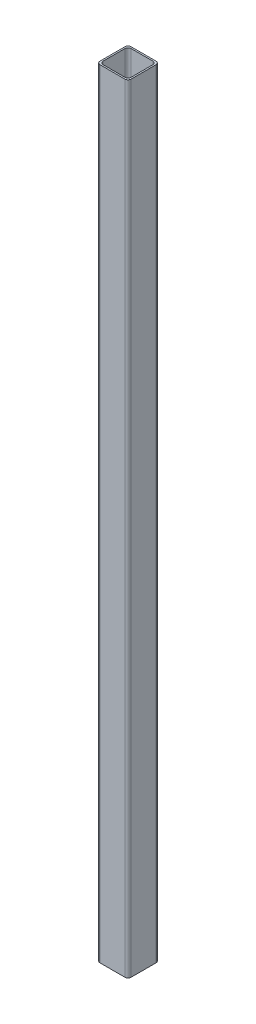
ISO-10303-21;
HEADER;
FILE_DESCRIPTION(('STEP AP214'),'2;1');
FILE_NAME('part.step','',(''),(''),'','','');
FILE_SCHEMA(('AUTOMOTIVE_DESIGN { 1 0 10303 214 1 1 1 1 }'));
ENDSEC;
DATA;
#1=APPLICATION_CONTEXT('core data for automotive mechanical design processes');
#2=APPLICATION_PROTOCOL_DEFINITION('international standard','automotive_design',2000,#1);
#3=PRODUCT_CONTEXT('',#1,'mechanical');
#4=PRODUCT('Part','Part','',(#3));
#5=PRODUCT_RELATED_PRODUCT_CATEGORY('part','',(#4));
#6=PRODUCT_DEFINITION_FORMATION('','',#4);
#7=PRODUCT_DEFINITION_CONTEXT('part definition',#1,'design');
#8=PRODUCT_DEFINITION('design','',#6,#7);
#9=PRODUCT_DEFINITION_SHAPE('','',#8);
#10=(LENGTH_UNIT() NAMED_UNIT(*) SI_UNIT(.MILLI.,.METRE.));
#11=(NAMED_UNIT(*) PLANE_ANGLE_UNIT() SI_UNIT($,.RADIAN.));
#12=(NAMED_UNIT(*) SI_UNIT($,.STERADIAN.) SOLID_ANGLE_UNIT());
#13=UNCERTAINTY_MEASURE_WITH_UNIT(LENGTH_MEASURE(1.E-05),#10,'distance_accuracy_value','');
#14=(GEOMETRIC_REPRESENTATION_CONTEXT(3) GLOBAL_UNCERTAINTY_ASSIGNED_CONTEXT((#13)) GLOBAL_UNIT_ASSIGNED_CONTEXT((#10,
#11,#12)) REPRESENTATION_CONTEXT('',''));
#15=CARTESIAN_POINT('',(0.,0.,0.));
#16=DIRECTION('',(0.,0.,1.));
#17=DIRECTION('',(1.,0.,0.));
#18=AXIS2_PLACEMENT_3D('',#15,#16,#17);
#19=CARTESIAN_POINT('',(16.,500.,16.));
#20=DIRECTION('',(0.,-1.,0.));
#21=DIRECTION('',(0.,0.,-1.));
#22=AXIS2_PLACEMENT_3D('',#19,#20,#21);
#23=PLANE('',#22);
#24=CARTESIAN_POINT('',(16.,500.,16.));
#25=DIRECTION('',(0.,1.,0.));
#26=DIRECTION('',(0.,0.,-1.));
#27=AXIS2_PLACEMENT_3D('',#24,#25,#26);
#28=CIRCLE('',#27,4.);
#29=CARTESIAN_POINT('',(16.,500.,20.));
#30=VERTEX_POINT('',#29);
#31=CARTESIAN_POINT('',(20.,500.,16.));
#32=VERTEX_POINT('',#31);
#33=EDGE_CURVE('E211',#30,#32,#28,.T.);
#34=ORIENTED_EDGE('',*,*,#33,.T.);
#35=DIRECTION('',(0.,0.,-1.));
#36=VECTOR('',#35,1.);
#37=CARTESIAN_POINT('',(20.,500.,16.));
#38=LINE('',#37,#36);
#39=CARTESIAN_POINT('',(20.,500.,-16.));
#40=VERTEX_POINT('',#39);
#41=EDGE_CURVE('E214',#32,#40,#38,.T.);
#42=ORIENTED_EDGE('',*,*,#41,.T.);
#43=CARTESIAN_POINT('',(16.,500.,-16.));
#44=DIRECTION('',(0.,1.,0.));
#45=DIRECTION('',(0.,0.,-1.));
#46=AXIS2_PLACEMENT_3D('',#43,#44,#45);
#47=CIRCLE('',#46,4.);
#48=CARTESIAN_POINT('',(16.,500.,-20.));
#49=VERTEX_POINT('',#48);
#50=EDGE_CURVE('E217',#40,#49,#47,.T.);
#51=ORIENTED_EDGE('',*,*,#50,.T.);
#52=DIRECTION('',(-1.,0.,0.));
#53=VECTOR('',#52,1.);
#54=CARTESIAN_POINT('',(-16.,500.,-20.));
#55=LINE('',#54,#53);
#56=CARTESIAN_POINT('',(-16.,500.,-20.));
#57=VERTEX_POINT('',#56);
#58=EDGE_CURVE('E219',#49,#57,#55,.T.);
#59=ORIENTED_EDGE('',*,*,#58,.T.);
#60=CARTESIAN_POINT('',(-16.,500.,-16.));
#61=DIRECTION('',(0.,1.,0.));
#62=DIRECTION('',(0.,0.,1.));
#63=AXIS2_PLACEMENT_3D('',#60,#61,#62);
#64=CIRCLE('',#63,4.);
#65=CARTESIAN_POINT('',(-20.,500.,-16.));
#66=VERTEX_POINT('',#65);
#67=EDGE_CURVE('E221',#57,#66,#64,.T.);
#68=ORIENTED_EDGE('',*,*,#67,.T.);
#69=DIRECTION('',(0.,0.,1.));
#70=VECTOR('',#69,1.);
#71=CARTESIAN_POINT('',(-20.,500.,16.));
#72=LINE('',#71,#70);
#73=CARTESIAN_POINT('',(-20.,500.,16.));
#74=VERTEX_POINT('',#73);
#75=EDGE_CURVE('E223',#66,#74,#72,.T.);
#76=ORIENTED_EDGE('',*,*,#75,.T.);
#77=CARTESIAN_POINT('',(-16.,500.,16.));
#78=DIRECTION('',(0.,1.,0.));
#79=DIRECTION('',(0.,0.,1.));
#80=AXIS2_PLACEMENT_3D('',#77,#78,#79);
#81=CIRCLE('',#80,4.);
#82=CARTESIAN_POINT('',(-16.,500.,20.));
#83=VERTEX_POINT('',#82);
#84=EDGE_CURVE('E225',#74,#83,#81,.T.);
#85=ORIENTED_EDGE('',*,*,#84,.T.);
#86=DIRECTION('',(1.,0.,0.));
#87=VECTOR('',#86,1.);
#88=CARTESIAN_POINT('',(-16.,500.,20.));
#89=LINE('',#88,#87);
#90=EDGE_CURVE('E227',#83,#30,#89,.T.);
#91=ORIENTED_EDGE('',*,*,#90,.T.);
#92=EDGE_LOOP('',(#34,#42,#51,#59,#68,#76,#85,#91));
#93=FACE_BOUND('',#92,.T.);
#94=CARTESIAN_POINT('',(14.,500.,14.));
#95=DIRECTION('',(0.,1.,0.));
#96=DIRECTION('',(0.,0.,1.));
#97=AXIS2_PLACEMENT_3D('',#94,#95,#96);
#98=CIRCLE('',#97,4.);
#99=CARTESIAN_POINT('',(14.,500.,18.));
#100=VERTEX_POINT('',#99);
#101=CARTESIAN_POINT('',(18.,500.,14.));
#102=VERTEX_POINT('',#101);
#103=EDGE_CURVE('E146',#100,#102,#98,.T.);
#104=ORIENTED_EDGE('',*,*,#103,.F.);
#105=DIRECTION('',(1.,0.,0.));
#106=VECTOR('',#105,1.);
#107=CARTESIAN_POINT('',(-14.,500.,18.));
#108=LINE('',#107,#106);
#109=CARTESIAN_POINT('',(-14.,500.,18.));
#110=VERTEX_POINT('',#109);
#111=EDGE_CURVE('E179',#110,#100,#108,.T.);
#112=ORIENTED_EDGE('',*,*,#111,.F.);
#113=CARTESIAN_POINT('',(-14.,500.,14.));
#114=DIRECTION('',(0.,1.,0.));
#115=DIRECTION('',(0.,0.,-1.));
#116=AXIS2_PLACEMENT_3D('',#113,#114,#115);
#117=CIRCLE('',#116,4.);
#118=CARTESIAN_POINT('',(-18.,500.,14.));
#119=VERTEX_POINT('',#118);
#120=EDGE_CURVE('E177',#119,#110,#117,.T.);
#121=ORIENTED_EDGE('',*,*,#120,.F.);
#122=DIRECTION('',(0.,0.,1.));
#123=VECTOR('',#122,1.);
#124=CARTESIAN_POINT('',(-18.,500.,14.));
#125=LINE('',#124,#123);
#126=CARTESIAN_POINT('',(-18.,500.,-14.));
#127=VERTEX_POINT('',#126);
#128=EDGE_CURVE('E175',#127,#119,#125,.T.);
#129=ORIENTED_EDGE('',*,*,#128,.F.);
#130=CARTESIAN_POINT('',(-14.,500.,-14.));
#131=DIRECTION('',(0.,1.,0.));
#132=DIRECTION('',(0.,0.,-1.));
#133=AXIS2_PLACEMENT_3D('',#130,#131,#132);
#134=CIRCLE('',#133,4.);
#135=CARTESIAN_POINT('',(-14.,500.,-18.));
#136=VERTEX_POINT('',#135);
#137=EDGE_CURVE('E173',#136,#127,#134,.T.);
#138=ORIENTED_EDGE('',*,*,#137,.F.);
#139=DIRECTION('',(-1.,0.,0.));
#140=VECTOR('',#139,1.);
#141=CARTESIAN_POINT('',(-14.,500.,-18.));
#142=LINE('',#141,#140);
#143=CARTESIAN_POINT('',(14.,500.,-18.));
#144=VERTEX_POINT('',#143);
#145=EDGE_CURVE('E169',#144,#136,#142,.T.);
#146=ORIENTED_EDGE('',*,*,#145,.F.);
#147=CARTESIAN_POINT('',(14.,500.,-14.));
#148=DIRECTION('',(0.,1.,0.));
#149=DIRECTION('',(0.,0.,1.));
#150=AXIS2_PLACEMENT_3D('',#147,#148,#149);
#151=CIRCLE('',#150,4.);
#152=CARTESIAN_POINT('',(18.,500.,-14.));
#153=VERTEX_POINT('',#152);
#154=EDGE_CURVE('E167',#153,#144,#151,.T.);
#155=ORIENTED_EDGE('',*,*,#154,.F.);
#156=DIRECTION('',(0.,0.,-1.));
#157=VECTOR('',#156,1.);
#158=CARTESIAN_POINT('',(18.,500.,14.));
#159=LINE('',#158,#157);
#160=EDGE_CURVE('E154',#102,#153,#159,.T.);
#161=ORIENTED_EDGE('',*,*,#160,.F.);
#162=EDGE_LOOP('',(#104,#112,#121,#129,#138,#146,#155,#161));
#163=FACE_BOUND('',#162,.T.);
#164=ADVANCED_FACE('F33',(#93,#163),#23,.F.);
#165=CARTESIAN_POINT('',(16.,-500.,16.));
#166=DIRECTION('',(0.,-1.,0.));
#167=DIRECTION('',(0.,0.,-1.));
#168=AXIS2_PLACEMENT_3D('',#165,#166,#167);
#169=PLANE('',#168);
#170=CARTESIAN_POINT('',(16.,-500.,16.));
#171=DIRECTION('',(0.,1.,0.));
#172=DIRECTION('',(0.,0.,-1.));
#173=AXIS2_PLACEMENT_3D('',#170,#171,#172);
#174=CIRCLE('',#173,4.);
#175=CARTESIAN_POINT('',(16.,-500.,20.));
#176=VERTEX_POINT('',#175);
#177=CARTESIAN_POINT('',(20.,-500.,16.));
#178=VERTEX_POINT('',#177);
#179=EDGE_CURVE('E162',#176,#178,#174,.T.);
#180=ORIENTED_EDGE('',*,*,#179,.F.);
#181=DIRECTION('',(1.,0.,0.));
#182=VECTOR('',#181,1.);
#183=CARTESIAN_POINT('',(-16.,-500.,20.));
#184=LINE('',#183,#182);
#185=CARTESIAN_POINT('',(-16.,-500.,20.));
#186=VERTEX_POINT('',#185);
#187=EDGE_CURVE('E215',#186,#176,#184,.T.);
#188=ORIENTED_EDGE('',*,*,#187,.F.);
#189=CARTESIAN_POINT('',(-16.,-500.,16.));
#190=DIRECTION('',(0.,1.,0.));
#191=DIRECTION('',(0.,0.,1.));
#192=AXIS2_PLACEMENT_3D('',#189,#190,#191);
#193=CIRCLE('',#192,4.);
#194=CARTESIAN_POINT('',(-20.,-500.,16.));
#195=VERTEX_POINT('',#194);
#196=EDGE_CURVE('E242',#195,#186,#193,.T.);
#197=ORIENTED_EDGE('',*,*,#196,.F.);
#198=DIRECTION('',(0.,0.,1.));
#199=VECTOR('',#198,1.);
#200=CARTESIAN_POINT('',(-20.,-500.,16.));
#201=LINE('',#200,#199);
#202=CARTESIAN_POINT('',(-20.,-500.,-16.));
#203=VERTEX_POINT('',#202);
#204=EDGE_CURVE('E240',#203,#195,#201,.T.);
#205=ORIENTED_EDGE('',*,*,#204,.F.);
#206=CARTESIAN_POINT('',(-16.,-500.,-16.));
#207=DIRECTION('',(0.,1.,0.));
#208=DIRECTION('',(0.,0.,1.));
#209=AXIS2_PLACEMENT_3D('',#206,#207,#208);
#210=CIRCLE('',#209,4.);
#211=CARTESIAN_POINT('',(-16.,-500.,-20.));
#212=VERTEX_POINT('',#211);
#213=EDGE_CURVE('E238',#212,#203,#210,.T.);
#214=ORIENTED_EDGE('',*,*,#213,.F.);
#215=DIRECTION('',(-1.,0.,0.));
#216=VECTOR('',#215,1.);
#217=CARTESIAN_POINT('',(-16.,-500.,-20.));
#218=LINE('',#217,#216);
#219=CARTESIAN_POINT('',(16.,-500.,-20.));
#220=VERTEX_POINT('',#219);
#221=EDGE_CURVE('E236',#220,#212,#218,.T.);
#222=ORIENTED_EDGE('',*,*,#221,.F.);
#223=CARTESIAN_POINT('',(16.,-500.,-16.));
#224=DIRECTION('',(0.,1.,0.));
#225=DIRECTION('',(0.,0.,-1.));
#226=AXIS2_PLACEMENT_3D('',#223,#224,#225);
#227=CIRCLE('',#226,4.);
#228=CARTESIAN_POINT('',(20.,-500.,-16.));
#229=VERTEX_POINT('',#228);
#230=EDGE_CURVE('E234',#229,#220,#227,.T.);
#231=ORIENTED_EDGE('',*,*,#230,.F.);
#232=DIRECTION('',(0.,0.,-1.));
#233=VECTOR('',#232,1.);
#234=CARTESIAN_POINT('',(20.,-500.,16.));
#235=LINE('',#234,#233);
#236=EDGE_CURVE('E232',#178,#229,#235,.T.);
#237=ORIENTED_EDGE('',*,*,#236,.F.);
#238=EDGE_LOOP('',(#180,#188,#197,#205,#214,#222,#231,#237));
#239=FACE_BOUND('',#238,.T.);
#240=DIRECTION('',(1.,0.,0.));
#241=VECTOR('',#240,1.);
#242=CARTESIAN_POINT('',(-14.,-500.,18.));
#243=LINE('',#242,#241);
#244=CARTESIAN_POINT('',(-14.,-500.,18.));
#245=VERTEX_POINT('',#244);
#246=CARTESIAN_POINT('',(14.,-500.,18.));
#247=VERTEX_POINT('',#246);
#248=EDGE_CURVE('E155',#245,#247,#243,.T.);
#249=ORIENTED_EDGE('',*,*,#248,.T.);
#250=CARTESIAN_POINT('',(14.,-500.,14.));
#251=DIRECTION('',(0.,1.,0.));
#252=DIRECTION('',(0.,0.,1.));
#253=AXIS2_PLACEMENT_3D('',#250,#251,#252);
#254=CIRCLE('',#253,4.);
#255=CARTESIAN_POINT('',(18.,-500.,14.));
#256=VERTEX_POINT('',#255);
#257=EDGE_CURVE('E56',#247,#256,#254,.T.);
#258=ORIENTED_EDGE('',*,*,#257,.T.);
#259=DIRECTION('',(0.,0.,-1.));
#260=VECTOR('',#259,1.);
#261=CARTESIAN_POINT('',(18.,-500.,14.));
#262=LINE('',#261,#260);
#263=CARTESIAN_POINT('',(18.,-500.,-14.));
#264=VERTEX_POINT('',#263);
#265=EDGE_CURVE('E161',#256,#264,#262,.T.);
#266=ORIENTED_EDGE('',*,*,#265,.T.);
#267=CARTESIAN_POINT('',(14.,-500.,-14.));
#268=DIRECTION('',(0.,1.,0.));
#269=DIRECTION('',(0.,0.,1.));
#270=AXIS2_PLACEMENT_3D('',#267,#268,#269);
#271=CIRCLE('',#270,4.);
#272=CARTESIAN_POINT('',(14.,-500.,-18.));
#273=VERTEX_POINT('',#272);
#274=EDGE_CURVE('E183',#264,#273,#271,.T.);
#275=ORIENTED_EDGE('',*,*,#274,.T.);
#276=DIRECTION('',(-1.,0.,0.));
#277=VECTOR('',#276,1.);
#278=CARTESIAN_POINT('',(-14.,-500.,-18.));
#279=LINE('',#278,#277);
#280=CARTESIAN_POINT('',(-14.,-500.,-18.));
#281=VERTEX_POINT('',#280);
#282=EDGE_CURVE('E186',#273,#281,#279,.T.);
#283=ORIENTED_EDGE('',*,*,#282,.T.);
#284=CARTESIAN_POINT('',(-14.,-500.,-14.));
#285=DIRECTION('',(0.,1.,0.));
#286=DIRECTION('',(0.,0.,-1.));
#287=AXIS2_PLACEMENT_3D('',#284,#285,#286);
#288=CIRCLE('',#287,4.);
#289=CARTESIAN_POINT('',(-18.,-500.,-14.));
#290=VERTEX_POINT('',#289);
#291=EDGE_CURVE('E189',#281,#290,#288,.T.);
#292=ORIENTED_EDGE('',*,*,#291,.T.);
#293=DIRECTION('',(0.,0.,1.));
#294=VECTOR('',#293,1.);
#295=CARTESIAN_POINT('',(-18.,-500.,14.));
#296=LINE('',#295,#294);
#297=CARTESIAN_POINT('',(-18.,-500.,14.));
#298=VERTEX_POINT('',#297);
#299=EDGE_CURVE('E192',#290,#298,#296,.T.);
#300=ORIENTED_EDGE('',*,*,#299,.T.);
#301=CARTESIAN_POINT('',(-14.,-500.,14.));
#302=DIRECTION('',(0.,1.,0.));
#303=DIRECTION('',(0.,0.,-1.));
#304=AXIS2_PLACEMENT_3D('',#301,#302,#303);
#305=CIRCLE('',#304,4.);
#306=EDGE_CURVE('E195',#298,#245,#305,.T.);
#307=ORIENTED_EDGE('',*,*,#306,.T.);
#308=EDGE_LOOP('',(#249,#258,#266,#275,#283,#292,#300,#307));
#309=FACE_BOUND('',#308,.T.);
#310=ADVANCED_FACE('F272',(#239,#309),#169,.T.);
#311=CARTESIAN_POINT('',(16.,500.,16.));
#312=DIRECTION('',(0.,-1.,0.));
#313=DIRECTION('',(0.,0.,-1.));
#314=AXIS2_PLACEMENT_3D('',#311,#312,#313);
#315=CYLINDRICAL_SURFACE('',#314,4.);
#316=ORIENTED_EDGE('',*,*,#179,.T.);
#317=DIRECTION('',(0.,-1.,0.));
#318=VECTOR('',#317,1.);
#319=CARTESIAN_POINT('',(20.,500.,16.));
#320=LINE('',#319,#318);
#321=EDGE_CURVE('E11',#32,#178,#320,.T.);
#322=ORIENTED_EDGE('',*,*,#321,.F.);
#323=ORIENTED_EDGE('',*,*,#33,.F.);
#324=DIRECTION('',(0.,-1.,0.));
#325=VECTOR('',#324,1.);
#326=CARTESIAN_POINT('',(16.,500.,20.));
#327=LINE('',#326,#325);
#328=EDGE_CURVE('E229',#30,#176,#327,.T.);
#329=ORIENTED_EDGE('',*,*,#328,.T.);
#330=EDGE_LOOP('',(#316,#322,#323,#329));
#331=FACE_BOUND('',#330,.T.);
#332=ADVANCED_FACE('F35',(#331),#315,.T.);
#333=CARTESIAN_POINT('',(20.,500.,16.));
#334=DIRECTION('',(-1.,0.,0.));
#335=DIRECTION('',(0.,0.,1.));
#336=AXIS2_PLACEMENT_3D('',#333,#334,#335);
#337=PLANE('',#336);
#338=ORIENTED_EDGE('',*,*,#236,.T.);
#339=DIRECTION('',(0.,-1.,0.));
#340=VECTOR('',#339,1.);
#341=CARTESIAN_POINT('',(20.,500.,-16.));
#342=LINE('',#341,#340);
#343=EDGE_CURVE('E41',#40,#229,#342,.T.);
#344=ORIENTED_EDGE('',*,*,#343,.F.);
#345=ORIENTED_EDGE('',*,*,#41,.F.);
#346=ORIENTED_EDGE('',*,*,#321,.T.);
#347=EDGE_LOOP('',(#338,#344,#345,#346));
#348=FACE_BOUND('',#347,.T.);
#349=ADVANCED_FACE('F289',(#348),#337,.F.);
#350=CARTESIAN_POINT('',(16.,500.,-16.));
#351=DIRECTION('',(0.,-1.,0.));
#352=DIRECTION('',(0.,0.,-1.));
#353=AXIS2_PLACEMENT_3D('',#350,#351,#352);
#354=CYLINDRICAL_SURFACE('',#353,4.);
#355=ORIENTED_EDGE('',*,*,#230,.T.);
#356=DIRECTION('',(0.,-1.,0.));
#357=VECTOR('',#356,1.);
#358=CARTESIAN_POINT('',(16.,500.,-20.));
#359=LINE('',#358,#357);
#360=EDGE_CURVE('E259',#49,#220,#359,.T.);
#361=ORIENTED_EDGE('',*,*,#360,.F.);
#362=ORIENTED_EDGE('',*,*,#50,.F.);
#363=ORIENTED_EDGE('',*,*,#343,.T.);
#364=EDGE_LOOP('',(#355,#361,#362,#363));
#365=FACE_BOUND('',#364,.T.);
#366=ADVANCED_FACE('F266',(#365),#354,.T.);
#367=CARTESIAN_POINT('',(-16.,500.,-20.));
#368=DIRECTION('',(0.,0.,1.));
#369=DIRECTION('',(1.,0.,0.));
#370=AXIS2_PLACEMENT_3D('',#367,#368,#369);
#371=PLANE('',#370);
#372=ORIENTED_EDGE('',*,*,#221,.T.);
#373=DIRECTION('',(0.,-1.,0.));
#374=VECTOR('',#373,1.);
#375=CARTESIAN_POINT('',(-16.,500.,-20.));
#376=LINE('',#375,#374);
#377=EDGE_CURVE('E256',#57,#212,#376,.T.);
#378=ORIENTED_EDGE('',*,*,#377,.F.);
#379=ORIENTED_EDGE('',*,*,#58,.F.);
#380=ORIENTED_EDGE('',*,*,#360,.T.);
#381=EDGE_LOOP('',(#372,#378,#379,#380));
#382=FACE_BOUND('',#381,.T.);
#383=ADVANCED_FACE('F278',(#382),#371,.F.);
#384=CARTESIAN_POINT('',(-16.,500.,-16.));
#385=DIRECTION('',(0.,-1.,0.));
#386=DIRECTION('',(0.,0.,-1.));
#387=AXIS2_PLACEMENT_3D('',#384,#385,#386);
#388=CYLINDRICAL_SURFACE('',#387,4.);
#389=ORIENTED_EDGE('',*,*,#213,.T.);
#390=DIRECTION('',(0.,-1.,0.));
#391=VECTOR('',#390,1.);
#392=CARTESIAN_POINT('',(-20.,500.,-16.));
#393=LINE('',#392,#391);
#394=EDGE_CURVE('E253',#66,#203,#393,.T.);
#395=ORIENTED_EDGE('',*,*,#394,.F.);
#396=ORIENTED_EDGE('',*,*,#67,.F.);
#397=ORIENTED_EDGE('',*,*,#377,.T.);
#398=EDGE_LOOP('',(#389,#395,#396,#397));
#399=FACE_BOUND('',#398,.T.);
#400=ADVANCED_FACE('F282',(#399),#388,.T.);
#401=CARTESIAN_POINT('',(-20.,500.,16.));
#402=DIRECTION('',(1.,0.,0.));
#403=DIRECTION('',(0.,0.,-1.));
#404=AXIS2_PLACEMENT_3D('',#401,#402,#403);
#405=PLANE('',#404);
#406=ORIENTED_EDGE('',*,*,#204,.T.);
#407=DIRECTION('',(0.,-1.,0.));
#408=VECTOR('',#407,1.);
#409=CARTESIAN_POINT('',(-20.,500.,16.));
#410=LINE('',#409,#408);
#411=EDGE_CURVE('E250',#74,#195,#410,.T.);
#412=ORIENTED_EDGE('',*,*,#411,.F.);
#413=ORIENTED_EDGE('',*,*,#75,.F.);
#414=ORIENTED_EDGE('',*,*,#394,.T.);
#415=EDGE_LOOP('',(#406,#412,#413,#414));
#416=FACE_BOUND('',#415,.T.);
#417=ADVANCED_FACE('F302',(#416),#405,.F.);
#418=CARTESIAN_POINT('',(-16.,500.,16.));
#419=DIRECTION('',(0.,-1.,0.));
#420=DIRECTION('',(0.,0.,-1.));
#421=AXIS2_PLACEMENT_3D('',#418,#419,#420);
#422=CYLINDRICAL_SURFACE('',#421,4.);
#423=ORIENTED_EDGE('',*,*,#196,.T.);
#424=DIRECTION('',(0.,-1.,0.));
#425=VECTOR('',#424,1.);
#426=CARTESIAN_POINT('',(-16.,500.,20.));
#427=LINE('',#426,#425);
#428=EDGE_CURVE('E247',#83,#186,#427,.T.);
#429=ORIENTED_EDGE('',*,*,#428,.F.);
#430=ORIENTED_EDGE('',*,*,#84,.F.);
#431=ORIENTED_EDGE('',*,*,#411,.T.);
#432=EDGE_LOOP('',(#423,#429,#430,#431));
#433=FACE_BOUND('',#432,.T.);
#434=ADVANCED_FACE('F300',(#433),#422,.T.);
#435=CARTESIAN_POINT('',(-16.,500.,20.));
#436=DIRECTION('',(0.,0.,-1.));
#437=DIRECTION('',(-1.,0.,0.));
#438=AXIS2_PLACEMENT_3D('',#435,#436,#437);
#439=PLANE('',#438);
#440=ORIENTED_EDGE('',*,*,#187,.T.);
#441=ORIENTED_EDGE('',*,*,#328,.F.);
#442=ORIENTED_EDGE('',*,*,#90,.F.);
#443=ORIENTED_EDGE('',*,*,#428,.T.);
#444=EDGE_LOOP('',(#440,#441,#442,#443));
#445=FACE_BOUND('',#444,.T.);
#446=ADVANCED_FACE('F295',(#445),#439,.F.);
#447=CARTESIAN_POINT('',(14.,500.,14.));
#448=DIRECTION('',(0.,-1.,0.));
#449=DIRECTION('',(0.,0.,-1.));
#450=AXIS2_PLACEMENT_3D('',#447,#448,#449);
#451=CYLINDRICAL_SURFACE('',#450,4.);
#452=ORIENTED_EDGE('',*,*,#257,.F.);
#453=DIRECTION('',(0.,-1.,0.));
#454=VECTOR('',#453,1.);
#455=CARTESIAN_POINT('',(14.,500.,18.));
#456=LINE('',#455,#454);
#457=EDGE_CURVE('E150',#100,#247,#456,.T.);
#458=ORIENTED_EDGE('',*,*,#457,.F.);
#459=ORIENTED_EDGE('',*,*,#103,.T.);
#460=DIRECTION('',(0.,-1.,0.));
#461=VECTOR('',#460,1.);
#462=CARTESIAN_POINT('',(18.,500.,14.));
#463=LINE('',#462,#461);
#464=EDGE_CURVE('E149',#102,#256,#463,.T.);
#465=ORIENTED_EDGE('',*,*,#464,.T.);
#466=EDGE_LOOP('',(#452,#458,#459,#465));
#467=FACE_BOUND('',#466,.T.);
#468=ADVANCED_FACE('F148',(#467),#451,.F.);
#469=CARTESIAN_POINT('',(18.,500.,14.));
#470=DIRECTION('',(-1.,0.,0.));
#471=DIRECTION('',(0.,0.,1.));
#472=AXIS2_PLACEMENT_3D('',#469,#470,#471);
#473=PLANE('',#472);
#474=ORIENTED_EDGE('',*,*,#265,.F.);
#475=ORIENTED_EDGE('',*,*,#464,.F.);
#476=ORIENTED_EDGE('',*,*,#160,.T.);
#477=DIRECTION('',(0.,-1.,0.));
#478=VECTOR('',#477,1.);
#479=CARTESIAN_POINT('',(18.,500.,-14.));
#480=LINE('',#479,#478);
#481=EDGE_CURVE('E163',#153,#264,#480,.T.);
#482=ORIENTED_EDGE('',*,*,#481,.T.);
#483=EDGE_LOOP('',(#474,#475,#476,#482));
#484=FACE_BOUND('',#483,.T.);
#485=ADVANCED_FACE('F158',(#484),#473,.T.);
#486=CARTESIAN_POINT('',(14.,500.,-14.));
#487=DIRECTION('',(0.,-1.,0.));
#488=DIRECTION('',(0.,0.,-1.));
#489=AXIS2_PLACEMENT_3D('',#486,#487,#488);
#490=CYLINDRICAL_SURFACE('',#489,4.);
#491=ORIENTED_EDGE('',*,*,#274,.F.);
#492=ORIENTED_EDGE('',*,*,#481,.F.);
#493=ORIENTED_EDGE('',*,*,#154,.T.);
#494=DIRECTION('',(0.,-1.,0.));
#495=VECTOR('',#494,1.);
#496=CARTESIAN_POINT('',(14.,500.,-18.));
#497=LINE('',#496,#495);
#498=EDGE_CURVE('E208',#144,#273,#497,.T.);
#499=ORIENTED_EDGE('',*,*,#498,.T.);
#500=EDGE_LOOP('',(#491,#492,#493,#499));
#501=FACE_BOUND('',#500,.T.);
#502=ADVANCED_FACE('F327',(#501),#490,.F.);
#503=CARTESIAN_POINT('',(-14.,500.,-18.));
#504=DIRECTION('',(0.,0.,1.));
#505=DIRECTION('',(1.,0.,0.));
#506=AXIS2_PLACEMENT_3D('',#503,#504,#505);
#507=PLANE('',#506);
#508=ORIENTED_EDGE('',*,*,#282,.F.);
#509=ORIENTED_EDGE('',*,*,#498,.F.);
#510=ORIENTED_EDGE('',*,*,#145,.T.);
#511=DIRECTION('',(0.,-1.,0.));
#512=VECTOR('',#511,1.);
#513=CARTESIAN_POINT('',(-14.,500.,-18.));
#514=LINE('',#513,#512);
#515=EDGE_CURVE('E206',#136,#281,#514,.T.);
#516=ORIENTED_EDGE('',*,*,#515,.T.);
#517=EDGE_LOOP('',(#508,#509,#510,#516));
#518=FACE_BOUND('',#517,.T.);
#519=ADVANCED_FACE('F331',(#518),#507,.T.);
#520=CARTESIAN_POINT('',(-14.,500.,-14.));
#521=DIRECTION('',(0.,-1.,0.));
#522=DIRECTION('',(0.,0.,-1.));
#523=AXIS2_PLACEMENT_3D('',#520,#521,#522);
#524=CYLINDRICAL_SURFACE('',#523,4.);
#525=ORIENTED_EDGE('',*,*,#291,.F.);
#526=ORIENTED_EDGE('',*,*,#515,.F.);
#527=ORIENTED_EDGE('',*,*,#137,.T.);
#528=DIRECTION('',(0.,-1.,0.));
#529=VECTOR('',#528,1.);
#530=CARTESIAN_POINT('',(-18.,500.,-14.));
#531=LINE('',#530,#529);
#532=EDGE_CURVE('E204',#127,#290,#531,.T.);
#533=ORIENTED_EDGE('',*,*,#532,.T.);
#534=EDGE_LOOP('',(#525,#526,#527,#533));
#535=FACE_BOUND('',#534,.T.);
#536=ADVANCED_FACE('F337',(#535),#524,.F.);
#537=CARTESIAN_POINT('',(-18.,500.,14.));
#538=DIRECTION('',(1.,0.,0.));
#539=DIRECTION('',(0.,0.,-1.));
#540=AXIS2_PLACEMENT_3D('',#537,#538,#539);
#541=PLANE('',#540);
#542=ORIENTED_EDGE('',*,*,#299,.F.);
#543=ORIENTED_EDGE('',*,*,#532,.F.);
#544=ORIENTED_EDGE('',*,*,#128,.T.);
#545=DIRECTION('',(0.,-1.,0.));
#546=VECTOR('',#545,1.);
#547=CARTESIAN_POINT('',(-18.,500.,14.));
#548=LINE('',#547,#546);
#549=EDGE_CURVE('E202',#119,#298,#548,.T.);
#550=ORIENTED_EDGE('',*,*,#549,.T.);
#551=EDGE_LOOP('',(#542,#543,#544,#550));
#552=FACE_BOUND('',#551,.T.);
#553=ADVANCED_FACE('F341',(#552),#541,.T.);
#554=CARTESIAN_POINT('',(-14.,500.,14.));
#555=DIRECTION('',(0.,-1.,0.));
#556=DIRECTION('',(0.,0.,-1.));
#557=AXIS2_PLACEMENT_3D('',#554,#555,#556);
#558=CYLINDRICAL_SURFACE('',#557,4.);
#559=ORIENTED_EDGE('',*,*,#306,.F.);
#560=ORIENTED_EDGE('',*,*,#549,.F.);
#561=ORIENTED_EDGE('',*,*,#120,.T.);
#562=DIRECTION('',(0.,-1.,0.));
#563=VECTOR('',#562,1.);
#564=CARTESIAN_POINT('',(-14.,500.,18.));
#565=LINE('',#564,#563);
#566=EDGE_CURVE('E48',#110,#245,#565,.T.);
#567=ORIENTED_EDGE('',*,*,#566,.T.);
#568=EDGE_LOOP('',(#559,#560,#561,#567));
#569=FACE_BOUND('',#568,.T.);
#570=ADVANCED_FACE('F345',(#569),#558,.F.);
#571=CARTESIAN_POINT('',(-14.,500.,18.));
#572=DIRECTION('',(0.,0.,-1.));
#573=DIRECTION('',(-1.,0.,0.));
#574=AXIS2_PLACEMENT_3D('',#571,#572,#573);
#575=PLANE('',#574);
#576=ORIENTED_EDGE('',*,*,#248,.F.);
#577=ORIENTED_EDGE('',*,*,#566,.F.);
#578=ORIENTED_EDGE('',*,*,#111,.T.);
#579=ORIENTED_EDGE('',*,*,#457,.T.);
#580=EDGE_LOOP('',(#576,#577,#578,#579));
#581=FACE_BOUND('',#580,.T.);
#582=ADVANCED_FACE('F349',(#581),#575,.T.);
#583=CLOSED_SHELL('',(#164,#310,#332,#349,#366,#383,#400,#417,#434,#446,#468,#485,#502,#519,
#536,#553,#570,#582));
#584=MANIFOLD_SOLID_BREP('B2',#583);
#585=ADVANCED_BREP_SHAPE_REPRESENTATION('',(#18,#584),#14);
#586=SHAPE_DEFINITION_REPRESENTATION(#9,#585);
ENDSEC;
END-ISO-10303-21;
